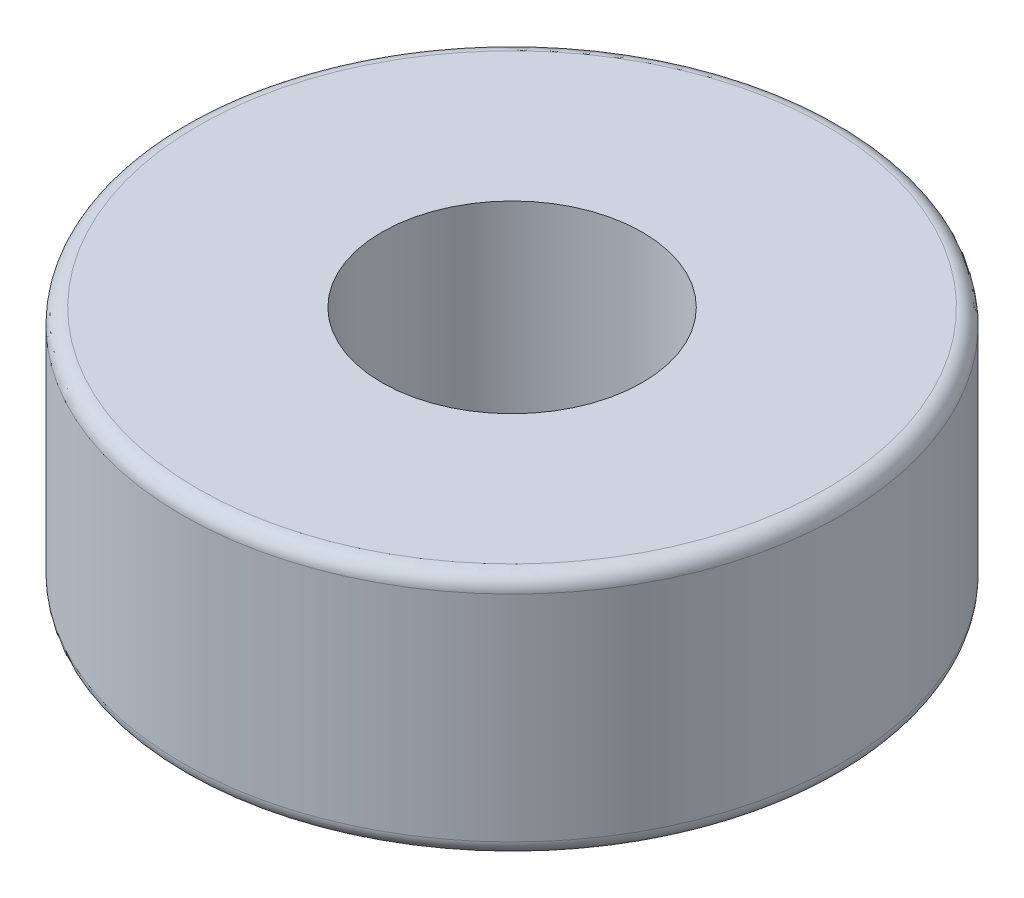
ISO-10303-21;
HEADER;
FILE_DESCRIPTION(('STEP AP214'),'2;1');
FILE_NAME('part.step','',(''),(''),'','','');
FILE_SCHEMA(('AUTOMOTIVE_DESIGN { 1 0 10303 214 1 1 1 1 }'));
ENDSEC;
DATA;
#1=APPLICATION_CONTEXT('core data for automotive mechanical design processes');
#2=APPLICATION_PROTOCOL_DEFINITION('international standard','automotive_design',2000,#1);
#3=PRODUCT_CONTEXT('',#1,'mechanical');
#4=PRODUCT('Part','Part','',(#3));
#5=PRODUCT_RELATED_PRODUCT_CATEGORY('part','',(#4));
#6=PRODUCT_DEFINITION_FORMATION('','',#4);
#7=PRODUCT_DEFINITION_CONTEXT('part definition',#1,'design');
#8=PRODUCT_DEFINITION('design','',#6,#7);
#9=PRODUCT_DEFINITION_SHAPE('','',#8);
#10=(LENGTH_UNIT() NAMED_UNIT(*) SI_UNIT(.MILLI.,.METRE.));
#11=(NAMED_UNIT(*) PLANE_ANGLE_UNIT() SI_UNIT($,.RADIAN.));
#12=(NAMED_UNIT(*) SI_UNIT($,.STERADIAN.) SOLID_ANGLE_UNIT());
#13=UNCERTAINTY_MEASURE_WITH_UNIT(LENGTH_MEASURE(1.E-05),#10,'distance_accuracy_value','');
#14=(GEOMETRIC_REPRESENTATION_CONTEXT(3) GLOBAL_UNCERTAINTY_ASSIGNED_CONTEXT((#13)) GLOBAL_UNIT_ASSIGNED_CONTEXT((#10,
#11,#12)) REPRESENTATION_CONTEXT('',''));
#15=CARTESIAN_POINT('',(0.,0.,0.));
#16=DIRECTION('',(0.,0.,1.));
#17=DIRECTION('',(1.,0.,0.));
#18=AXIS2_PLACEMENT_3D('',#15,#16,#17);
#19=CARTESIAN_POINT('',(0.,0.5,0.));
#20=DIRECTION('',(0.,1.,0.));
#21=DIRECTION('',(0.,0.,1.));
#22=AXIS2_PLACEMENT_3D('',#19,#20,#21);
#23=TOROIDAL_SURFACE('',#22,10.25,0.5);
#24=CARTESIAN_POINT('',(0.,0.,0.));
#25=DIRECTION('',(0.,1.,0.));
#26=DIRECTION('',(0.,0.,1.));
#27=AXIS2_PLACEMENT_3D('',#24,#25,#26);
#28=CIRCLE('',#27,10.25);
#29=CARTESIAN_POINT('',(0.,0.,10.25));
#30=VERTEX_POINT('',#29);
#31=EDGE_CURVE('E39',#30,#30,#28,.F.);
#32=ORIENTED_EDGE('',*,*,#31,.F.);
#33=EDGE_LOOP('',(#32));
#34=FACE_BOUND('',#33,.T.);
#35=CARTESIAN_POINT('',(0.,0.5,0.));
#36=DIRECTION('',(0.,1.,0.));
#37=DIRECTION('',(0.,0.,1.));
#38=AXIS2_PLACEMENT_3D('',#35,#36,#37);
#39=CIRCLE('',#38,10.75);
#40=CARTESIAN_POINT('',(0.,0.5,10.75));
#41=VERTEX_POINT('',#40);
#42=EDGE_CURVE('E10',#41,#41,#39,.T.);
#43=ORIENTED_EDGE('',*,*,#42,.F.);
#44=EDGE_LOOP('',(#43));
#45=FACE_BOUND('',#44,.T.);
#46=ADVANCED_FACE('F33',(#34,#45),#23,.T.);
#47=CARTESIAN_POINT('',(0.,7.5,0.));
#48=DIRECTION('',(0.,1.,0.));
#49=DIRECTION('',(0.,0.,1.));
#50=AXIS2_PLACEMENT_3D('',#47,#48,#49);
#51=TOROIDAL_SURFACE('',#50,10.25,0.5);
#52=CARTESIAN_POINT('',(0.,8.,0.));
#53=DIRECTION('',(0.,1.,0.));
#54=DIRECTION('',(0.,0.,1.));
#55=AXIS2_PLACEMENT_3D('',#52,#53,#54);
#56=CIRCLE('',#55,10.25);
#57=CARTESIAN_POINT('',(0.,8.,10.25));
#58=VERTEX_POINT('',#57);
#59=EDGE_CURVE('E47',#58,#58,#56,.T.);
#60=ORIENTED_EDGE('',*,*,#59,.F.);
#61=EDGE_LOOP('',(#60));
#62=FACE_BOUND('',#61,.T.);
#63=CARTESIAN_POINT('',(0.,7.5,0.));
#64=DIRECTION('',(0.,1.,0.));
#65=DIRECTION('',(0.,0.,1.));
#66=AXIS2_PLACEMENT_3D('',#63,#64,#65);
#67=CIRCLE('',#66,10.75);
#68=CARTESIAN_POINT('',(0.,7.5,10.75));
#69=VERTEX_POINT('',#68);
#70=EDGE_CURVE('E43',#69,#69,#67,.F.);
#71=ORIENTED_EDGE('',*,*,#70,.F.);
#72=EDGE_LOOP('',(#71));
#73=FACE_BOUND('',#72,.T.);
#74=ADVANCED_FACE('F65',(#62,#73),#51,.T.);
#75=CARTESIAN_POINT('',(0.,8.,0.));
#76=DIRECTION('',(0.,1.,0.));
#77=DIRECTION('',(0.,0.,1.));
#78=AXIS2_PLACEMENT_3D('',#75,#76,#77);
#79=PLANE('',#78);
#80=ORIENTED_EDGE('',*,*,#59,.T.);
#81=EDGE_LOOP('',(#80));
#82=FACE_BOUND('',#81,.T.);
#83=CARTESIAN_POINT('',(0.,8.,0.));
#84=DIRECTION('',(0.,1.,0.));
#85=DIRECTION('',(0.,0.,1.));
#86=AXIS2_PLACEMENT_3D('',#83,#84,#85);
#87=CIRCLE('',#86,4.25);
#88=CARTESIAN_POINT('',(0.,8.,4.25));
#89=VERTEX_POINT('',#88);
#90=EDGE_CURVE('E52',#89,#89,#87,.T.);
#91=ORIENTED_EDGE('',*,*,#90,.F.);
#92=EDGE_LOOP('',(#91));
#93=FACE_BOUND('',#92,.T.);
#94=ADVANCED_FACE('F62',(#82,#93),#79,.T.);
#95=CARTESIAN_POINT('',(0.,0.,0.));
#96=DIRECTION('',(0.,1.,0.));
#97=DIRECTION('',(0.,0.,1.));
#98=AXIS2_PLACEMENT_3D('',#95,#96,#97);
#99=PLANE('',#98);
#100=ORIENTED_EDGE('',*,*,#31,.T.);
#101=EDGE_LOOP('',(#100));
#102=FACE_BOUND('',#101,.T.);
#103=CARTESIAN_POINT('',(0.,0.,0.));
#104=DIRECTION('',(0.,1.,0.));
#105=DIRECTION('',(0.,0.,1.));
#106=AXIS2_PLACEMENT_3D('',#103,#104,#105);
#107=CIRCLE('',#106,4.25);
#108=CARTESIAN_POINT('',(0.,0.,4.25));
#109=VERTEX_POINT('',#108);
#110=EDGE_CURVE('E53',#109,#109,#107,.T.);
#111=ORIENTED_EDGE('',*,*,#110,.T.);
#112=EDGE_LOOP('',(#111));
#113=FACE_BOUND('',#112,.T.);
#114=ADVANCED_FACE('F64',(#102,#113),#99,.F.);
#115=CARTESIAN_POINT('',(0.,8.,0.));
#116=DIRECTION('',(0.,-1.,0.));
#117=DIRECTION('',(0.,0.,-1.));
#118=AXIS2_PLACEMENT_3D('',#115,#116,#117);
#119=CYLINDRICAL_SURFACE('',#118,10.75);
#120=ORIENTED_EDGE('',*,*,#42,.T.);
#121=EDGE_LOOP('',(#120));
#122=FACE_BOUND('',#121,.T.);
#123=ORIENTED_EDGE('',*,*,#70,.T.);
#124=EDGE_LOOP('',(#123));
#125=FACE_BOUND('',#124,.T.);
#126=ADVANCED_FACE('F73',(#122,#125),#119,.T.);
#127=CARTESIAN_POINT('',(0.,8.,0.));
#128=DIRECTION('',(0.,-1.,0.));
#129=DIRECTION('',(0.,0.,-1.));
#130=AXIS2_PLACEMENT_3D('',#127,#128,#129);
#131=CYLINDRICAL_SURFACE('',#130,4.25);
#132=ORIENTED_EDGE('',*,*,#90,.T.);
#133=EDGE_LOOP('',(#132));
#134=FACE_BOUND('',#133,.T.);
#135=ORIENTED_EDGE('',*,*,#110,.F.);
#136=EDGE_LOOP('',(#135));
#137=FACE_BOUND('',#136,.T.);
#138=ADVANCED_FACE('F59',(#134,#137),#131,.F.);
#139=CLOSED_SHELL('',(#46,#74,#94,#114,#126,#138));
#140=MANIFOLD_SOLID_BREP('B2',#139);
#141=ADVANCED_BREP_SHAPE_REPRESENTATION('',(#18,#140),#14);
#142=SHAPE_DEFINITION_REPRESENTATION(#9,#141);
ENDSEC;
END-ISO-10303-21;
